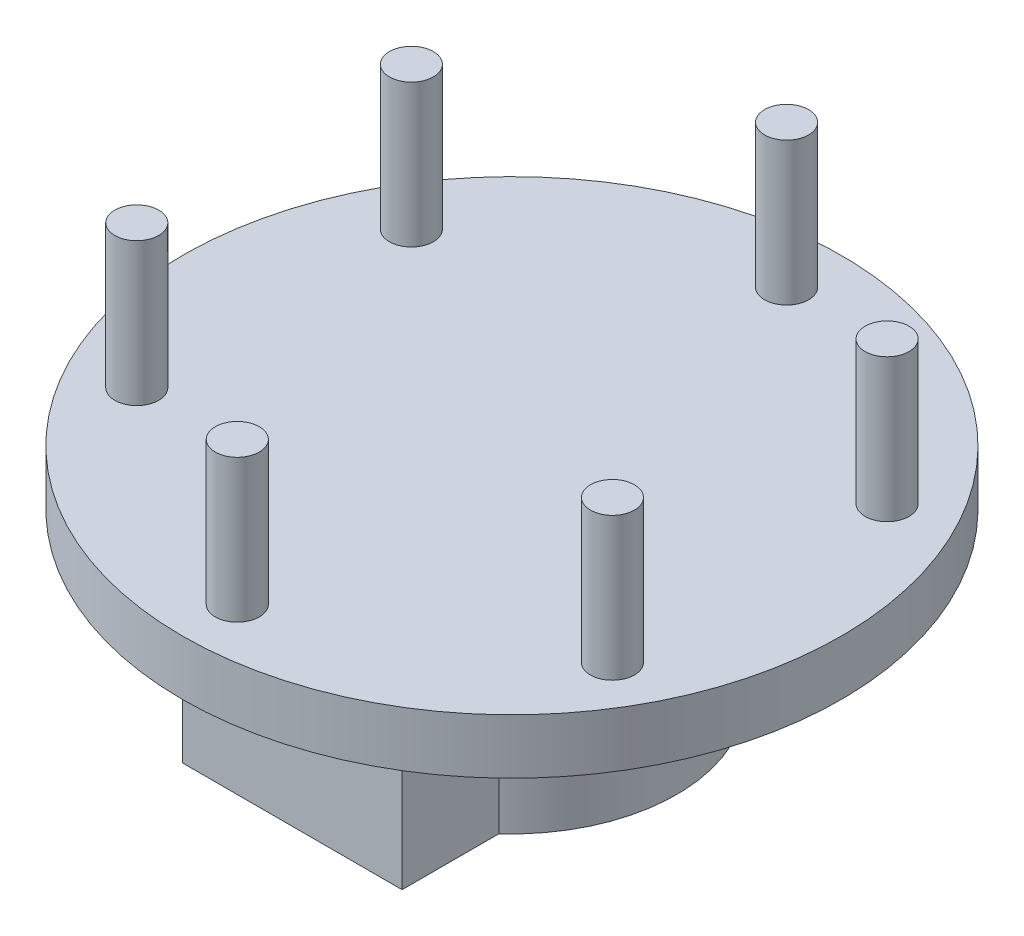
ISO-10303-21;
HEADER;
FILE_DESCRIPTION(('STEP AP214'),'2;1');
FILE_NAME('part.step','',(''),(''),'','','');
FILE_SCHEMA(('AUTOMOTIVE_DESIGN { 1 0 10303 214 1 1 1 1 }'));
ENDSEC;
DATA;
#1=APPLICATION_CONTEXT('core data for automotive mechanical design processes');
#2=APPLICATION_PROTOCOL_DEFINITION('international standard','automotive_design',2000,#1);
#3=PRODUCT_CONTEXT('',#1,'mechanical');
#4=PRODUCT('Part','Part','',(#3));
#5=PRODUCT_RELATED_PRODUCT_CATEGORY('part','',(#4));
#6=PRODUCT_DEFINITION_FORMATION('','',#4);
#7=PRODUCT_DEFINITION_CONTEXT('part definition',#1,'design');
#8=PRODUCT_DEFINITION('design','',#6,#7);
#9=PRODUCT_DEFINITION_SHAPE('','',#8);
#10=(LENGTH_UNIT() NAMED_UNIT(*) SI_UNIT(.MILLI.,.METRE.));
#11=(NAMED_UNIT(*) PLANE_ANGLE_UNIT() SI_UNIT($,.RADIAN.));
#12=(NAMED_UNIT(*) SI_UNIT($,.STERADIAN.) SOLID_ANGLE_UNIT());
#13=UNCERTAINTY_MEASURE_WITH_UNIT(LENGTH_MEASURE(1.E-05),#10,'distance_accuracy_value','');
#14=(GEOMETRIC_REPRESENTATION_CONTEXT(3) GLOBAL_UNCERTAINTY_ASSIGNED_CONTEXT((#13)) GLOBAL_UNIT_ASSIGNED_CONTEXT((#10,
#11,#12)) REPRESENTATION_CONTEXT('',''));
#15=CARTESIAN_POINT('',(0.,0.,0.));
#16=DIRECTION('',(0.,0.,1.));
#17=DIRECTION('',(1.,0.,0.));
#18=AXIS2_PLACEMENT_3D('',#15,#16,#17);
#19=CARTESIAN_POINT('',(0.,0.,0.));
#20=DIRECTION('',(0.,1.,0.));
#21=DIRECTION('',(0.,0.,1.));
#22=AXIS2_PLACEMENT_3D('',#19,#20,#21);
#23=PLANE('',#22);
#24=CARTESIAN_POINT('',(0.,0.,0.));
#25=DIRECTION('',(0.,1.,0.));
#26=DIRECTION('',(0.,0.,1.));
#27=AXIS2_PLACEMENT_3D('',#24,#25,#26);
#28=CIRCLE('',#27,30.);
#29=CARTESIAN_POINT('',(0.,0.,30.));
#30=VERTEX_POINT('',#29);
#31=EDGE_CURVE('E37',#30,#30,#28,.T.);
#32=ORIENTED_EDGE('',*,*,#31,.F.);
#33=EDGE_LOOP('',(#32));
#34=FACE_BOUND('',#33,.T.);
#35=DIRECTION('',(0.,0.,1.));
#36=VECTOR('',#35,1.);
#37=CARTESIAN_POINT('',(10.,0.,20.));
#38=LINE('',#37,#36);
#39=CARTESIAN_POINT('',(10.,0.,11.180339887499));
#40=VERTEX_POINT('',#39);
#41=CARTESIAN_POINT('',(10.,0.,20.));
#42=VERTEX_POINT('',#41);
#43=EDGE_CURVE('E48',#40,#42,#38,.T.);
#44=ORIENTED_EDGE('',*,*,#43,.F.);
#45=CARTESIAN_POINT('',(0.,0.,0.));
#46=DIRECTION('',(0.,-1.,0.));
#47=DIRECTION('',(0.,0.,-1.));
#48=AXIS2_PLACEMENT_3D('',#45,#46,#47);
#49=CIRCLE('',#48,15.);
#50=CARTESIAN_POINT('',(-9.99999999999999,0.,11.180339887499));
#51=VERTEX_POINT('',#50);
#52=EDGE_CURVE('E52',#51,#40,#49,.T.);
#53=ORIENTED_EDGE('',*,*,#52,.F.);
#54=DIRECTION('',(0.,0.,-1.));
#55=VECTOR('',#54,1.);
#56=CARTESIAN_POINT('',(-9.99999999999999,0.,20.));
#57=LINE('',#56,#55);
#58=CARTESIAN_POINT('',(-9.99999999999999,0.,20.));
#59=VERTEX_POINT('',#58);
#60=EDGE_CURVE('E335',#59,#51,#57,.T.);
#61=ORIENTED_EDGE('',*,*,#60,.F.);
#62=DIRECTION('',(-1.,0.,0.));
#63=VECTOR('',#62,1.);
#64=CARTESIAN_POINT('',(-9.99999999999999,0.,20.));
#65=LINE('',#64,#63);
#66=EDGE_CURVE('E341',#42,#59,#65,.T.);
#67=ORIENTED_EDGE('',*,*,#66,.F.);
#68=EDGE_LOOP('',(#44,#53,#61,#67));
#69=FACE_BOUND('',#68,.T.);
#70=ADVANCED_FACE('F33',(#34,#69),#23,.F.);
#71=CARTESIAN_POINT('',(0.,5.,0.));
#72=DIRECTION('',(0.,-1.,0.));
#73=DIRECTION('',(0.,0.,-1.));
#74=AXIS2_PLACEMENT_3D('',#71,#72,#73);
#75=CYLINDRICAL_SURFACE('',#74,30.);
#76=CARTESIAN_POINT('',(0.,5.,0.));
#77=DIRECTION('',(0.,1.,0.));
#78=DIRECTION('',(0.,0.,1.));
#79=AXIS2_PLACEMENT_3D('',#76,#77,#78);
#80=CIRCLE('',#79,30.);
#81=CARTESIAN_POINT('',(0.,5.,30.));
#82=VERTEX_POINT('',#81);
#83=EDGE_CURVE('E11',#82,#82,#80,.T.);
#84=ORIENTED_EDGE('',*,*,#83,.F.);
#85=EDGE_LOOP('',(#84));
#86=FACE_BOUND('',#85,.T.);
#87=ORIENTED_EDGE('',*,*,#31,.T.);
#88=EDGE_LOOP('',(#87));
#89=FACE_BOUND('',#88,.T.);
#90=ADVANCED_FACE('F35',(#86,#89),#75,.T.);
#91=CARTESIAN_POINT('',(0.,5.,0.));
#92=DIRECTION('',(0.,1.,0.));
#93=DIRECTION('',(0.,0.,1.));
#94=AXIS2_PLACEMENT_3D('',#91,#92,#93);
#95=PLANE('',#94);
#96=CARTESIAN_POINT('',(-21.6506350946104,5.,-12.4999999999991));
#97=DIRECTION('',(0.,1.,0.));
#98=DIRECTION('',(0.,0.,1.));
#99=AXIS2_PLACEMENT_3D('',#96,#97,#98);
#100=CIRCLE('',#99,2.);
#101=CARTESIAN_POINT('',(-21.6506350946104,5.,-14.4999999999991));
#102=VERTEX_POINT('',#101);
#103=EDGE_CURVE('E94',#102,#102,#100,.T.);
#104=ORIENTED_EDGE('',*,*,#103,.F.);
#105=EDGE_LOOP('',(#104));
#106=FACE_BOUND('',#105,.T.);
#107=CARTESIAN_POINT('',(-21.6506350946094,5.,12.5000000000009));
#108=DIRECTION('',(0.,1.,0.));
#109=DIRECTION('',(0.,0.,1.));
#110=AXIS2_PLACEMENT_3D('',#107,#108,#109);
#111=CIRCLE('',#110,2.);
#112=CARTESIAN_POINT('',(-21.6506350946094,5.,10.5000000000009));
#113=VERTEX_POINT('',#112);
#114=EDGE_CURVE('E104',#113,#113,#111,.T.);
#115=ORIENTED_EDGE('',*,*,#114,.F.);
#116=EDGE_LOOP('',(#115));
#117=FACE_BOUND('',#116,.T.);
#118=CARTESIAN_POINT('',(2.1224433562867E-12,5.,25.));
#119=DIRECTION('',(0.,1.,0.));
#120=DIRECTION('',(0.,0.,1.));
#121=AXIS2_PLACEMENT_3D('',#118,#119,#120);
#122=CIRCLE('',#121,2.);
#123=CARTESIAN_POINT('',(2.1224433562867E-12,5.,23.));
#124=VERTEX_POINT('',#123);
#125=EDGE_CURVE('E109',#124,#124,#122,.T.);
#126=ORIENTED_EDGE('',*,*,#125,.F.);
#127=EDGE_LOOP('',(#126));
#128=FACE_BOUND('',#127,.T.);
#129=CARTESIAN_POINT('',(21.6506350946126,5.,12.4999999999991));
#130=DIRECTION('',(0.,1.,0.));
#131=DIRECTION('',(0.,0.,1.));
#132=AXIS2_PLACEMENT_3D('',#129,#130,#131);
#133=CIRCLE('',#132,2.);
#134=CARTESIAN_POINT('',(21.6506350946126,5.,10.4999999999991));
#135=VERTEX_POINT('',#134);
#136=EDGE_CURVE('E115',#135,#135,#133,.T.);
#137=ORIENTED_EDGE('',*,*,#136,.F.);
#138=EDGE_LOOP('',(#137));
#139=FACE_BOUND('',#138,.T.);
#140=CARTESIAN_POINT('',(21.6506350946115,5.,-12.5000000000009));
#141=DIRECTION('',(0.,1.,0.));
#142=DIRECTION('',(0.,0.,1.));
#143=AXIS2_PLACEMENT_3D('',#140,#141,#142);
#144=CIRCLE('',#143,2.);
#145=CARTESIAN_POINT('',(21.6506350946115,5.,-14.5000000000009));
#146=VERTEX_POINT('',#145);
#147=EDGE_CURVE('E121',#146,#146,#144,.T.);
#148=ORIENTED_EDGE('',*,*,#147,.F.);
#149=EDGE_LOOP('',(#148));
#150=FACE_BOUND('',#149,.T.);
#151=CARTESIAN_POINT('',(0.,5.,-25.));
#152=DIRECTION('',(0.,1.,0.));
#153=DIRECTION('',(0.,0.,1.));
#154=AXIS2_PLACEMENT_3D('',#151,#152,#153);
#155=CIRCLE('',#154,2.);
#156=CARTESIAN_POINT('',(0.,5.,-27.));
#157=VERTEX_POINT('',#156);
#158=EDGE_CURVE('E127',#157,#157,#155,.T.);
#159=ORIENTED_EDGE('',*,*,#158,.F.);
#160=EDGE_LOOP('',(#159));
#161=FACE_BOUND('',#160,.T.);
#162=ORIENTED_EDGE('',*,*,#83,.T.);
#163=EDGE_LOOP('',(#162));
#164=FACE_BOUND('',#163,.T.);
#165=ADVANCED_FACE('F138',(#106,#117,#128,#139,#150,#161,#164),#95,.T.);
#166=CARTESIAN_POINT('',(0.,18.,-25.));
#167=DIRECTION('',(0.,-1.,0.));
#168=DIRECTION('',(0.,0.,-1.));
#169=AXIS2_PLACEMENT_3D('',#166,#167,#168);
#170=CYLINDRICAL_SURFACE('',#169,2.);
#171=CARTESIAN_POINT('',(0.,18.,-25.));
#172=DIRECTION('',(0.,1.,0.));
#173=DIRECTION('',(0.,0.,1.));
#174=AXIS2_PLACEMENT_3D('',#171,#172,#173);
#175=CIRCLE('',#174,2.);
#176=CARTESIAN_POINT('',(0.,18.,-27.));
#177=VERTEX_POINT('',#176);
#178=EDGE_CURVE('E130',#177,#177,#175,.T.);
#179=CARTESIAN_POINT('',(0.,18.,-27.));
#180=CARTESIAN_POINT('',(0.,17.8645833333333,-27.));
#181=CARTESIAN_POINT('',(0.,17.7291666666667,-27.));
#182=CARTESIAN_POINT('',(0.,17.4583333333333,-27.));
#183=CARTESIAN_POINT('',(0.,17.3229166666667,-27.));
#184=CARTESIAN_POINT('',(0.,17.0520833333333,-27.));
#185=CARTESIAN_POINT('',(0.,16.9166666666667,-27.));
#186=CARTESIAN_POINT('',(0.,16.6458333333333,-27.));
#187=CARTESIAN_POINT('',(0.,16.5104166666667,-27.));
#188=CARTESIAN_POINT('',(0.,16.2395833333333,-27.));
#189=CARTESIAN_POINT('',(0.,16.1041666666667,-27.));
#190=CARTESIAN_POINT('',(0.,15.8333333333333,-27.));
#191=CARTESIAN_POINT('',(0.,15.6979166666667,-27.));
#192=CARTESIAN_POINT('',(0.,15.4270833333333,-27.));
#193=CARTESIAN_POINT('',(0.,15.2916666666667,-27.));
#194=CARTESIAN_POINT('',(0.,15.0208333333333,-27.));
#195=CARTESIAN_POINT('',(0.,14.8854166666667,-27.));
#196=CARTESIAN_POINT('',(0.,14.6145833333333,-27.));
#197=CARTESIAN_POINT('',(0.,14.4791666666667,-27.));
#198=CARTESIAN_POINT('',(0.,14.2083333333333,-27.));
#199=CARTESIAN_POINT('',(0.,14.0729166666667,-27.));
#200=CARTESIAN_POINT('',(0.,13.8020833333333,-27.));
#201=CARTESIAN_POINT('',(0.,13.6666666666667,-27.));
#202=CARTESIAN_POINT('',(0.,13.3958333333333,-27.));
#203=CARTESIAN_POINT('',(0.,13.2604166666667,-27.));
#204=CARTESIAN_POINT('',(0.,12.9895833333333,-27.));
#205=CARTESIAN_POINT('',(0.,12.8541666666667,-27.));
#206=CARTESIAN_POINT('',(0.,12.5833333333333,-27.));
#207=CARTESIAN_POINT('',(0.,12.4479166666667,-27.));
#208=CARTESIAN_POINT('',(0.,12.1770833333333,-27.));
#209=CARTESIAN_POINT('',(0.,12.0416666666667,-27.));
#210=CARTESIAN_POINT('',(0.,11.7708333333333,-27.));
#211=CARTESIAN_POINT('',(0.,11.6354166666667,-27.));
#212=CARTESIAN_POINT('',(0.,11.3645833333333,-27.));
#213=CARTESIAN_POINT('',(0.,11.2291666666667,-27.));
#214=CARTESIAN_POINT('',(0.,10.9583333333333,-27.));
#215=CARTESIAN_POINT('',(0.,10.8229166666667,-27.));
#216=CARTESIAN_POINT('',(0.,10.5520833333333,-27.));
#217=CARTESIAN_POINT('',(0.,10.4166666666667,-27.));
#218=CARTESIAN_POINT('',(0.,10.1458333333333,-27.));
#219=CARTESIAN_POINT('',(0.,10.0104166666667,-27.));
#220=CARTESIAN_POINT('',(0.,9.73958333333333,-27.));
#221=CARTESIAN_POINT('',(0.,9.60416666666667,-27.));
#222=CARTESIAN_POINT('',(0.,9.33333333333333,-27.));
#223=CARTESIAN_POINT('',(0.,9.19791666666667,-27.));
#224=CARTESIAN_POINT('',(0.,8.92708333333333,-27.));
#225=CARTESIAN_POINT('',(0.,8.79166666666667,-27.));
#226=CARTESIAN_POINT('',(0.,8.52083333333333,-27.));
#227=CARTESIAN_POINT('',(0.,8.38541666666667,-27.));
#228=CARTESIAN_POINT('',(0.,8.11458333333333,-27.));
#229=CARTESIAN_POINT('',(0.,7.97916666666667,-27.));
#230=CARTESIAN_POINT('',(0.,7.70833333333333,-27.));
#231=CARTESIAN_POINT('',(0.,7.57291666666667,-27.));
#232=CARTESIAN_POINT('',(0.,7.30208333333333,-27.));
#233=CARTESIAN_POINT('',(0.,7.16666666666667,-27.));
#234=CARTESIAN_POINT('',(0.,6.89583333333333,-27.));
#235=CARTESIAN_POINT('',(0.,6.76041666666667,-27.));
#236=CARTESIAN_POINT('',(0.,6.48958333333333,-27.));
#237=CARTESIAN_POINT('',(0.,6.35416666666667,-27.));
#238=CARTESIAN_POINT('',(0.,6.08333333333333,-27.));
#239=CARTESIAN_POINT('',(0.,5.94791666666667,-27.));
#240=CARTESIAN_POINT('',(0.,5.67708333333333,-27.));
#241=CARTESIAN_POINT('',(0.,5.54166666666667,-27.));
#242=CARTESIAN_POINT('',(0.,5.27083333333333,-27.));
#243=CARTESIAN_POINT('',(0.,5.13541666666667,-27.));
#244=CARTESIAN_POINT('',(0.,5.,-27.));
#245=B_SPLINE_CURVE_WITH_KNOTS('',3,(#179,#180,#181,#182,#183,#184,#185,#186,#187,#188,#189,
#190,#191,#192,#193,#194,#195,#196,#197,#198,#199,#200,#201,#202,#203,#204,#205,#206,#207,#208,
#209,#210,#211,#212,#213,#214,#215,#216,#217,#218,#219,#220,#221,#222,#223,#224,#225,#226,#227,
#228,#229,#230,#231,#232,#233,#234,#235,#236,#237,#238,#239,#240,#241,#242,#243,#244),
.UNSPECIFIED.,.F.,.F.,(4,2,2,2,2,2,2,2,2,2,2,2,2,2,2,2,2,2,2,2,2,2,2,2,2,2,2,2,2,2,2,2,4),(0.,
0.406249999999997,0.812499999999997,1.21875,1.625,2.03125,2.4375,2.84375,3.25,3.65625,4.0625,
4.46875,4.875,5.28125,5.6875,6.09375,6.5,6.90625,7.3125,7.71875,8.125,8.53124999999999,8.9375,
9.34375,9.75,10.15625,10.5625,10.96875,11.375,11.78125,12.1875,12.59375,13.),.UNSPECIFIED.);
#246=EDGE_CURVE('BSEAM136',#177,#157,#245,.T.);
#247=ORIENTED_EDGE('',*,*,#178,.F.);
#248=ORIENTED_EDGE('',*,*,#158,.T.);
#249=ORIENTED_EDGE('',*,*,#246,.T.);
#250=ORIENTED_EDGE('',*,*,#246,.F.);
#251=EDGE_LOOP('',(#247,#249,#248,#250));
#252=FACE_BOUND('',#251,.T.);
#253=ADVANCED_FACE('F136',(#252),#170,.T.);
#254=CARTESIAN_POINT('',(0.,18.,-25.));
#255=DIRECTION('',(0.,1.,0.));
#256=DIRECTION('',(0.,0.,1.));
#257=AXIS2_PLACEMENT_3D('',#254,#255,#256);
#258=PLANE('',#257);
#259=ORIENTED_EDGE('',*,*,#178,.T.);
#260=EDGE_LOOP('',(#259));
#261=FACE_BOUND('',#260,.T.);
#262=ADVANCED_FACE('F156',(#261),#258,.T.);
#263=CARTESIAN_POINT('',(21.6506350946115,18.,-12.5000000000009));
#264=DIRECTION('',(0.,-1.,0.));
#265=DIRECTION('',(0.,0.,-1.));
#266=AXIS2_PLACEMENT_3D('',#263,#264,#265);
#267=CYLINDRICAL_SURFACE('',#266,2.);
#268=CARTESIAN_POINT('',(21.6506350946115,18.,-12.5000000000009));
#269=DIRECTION('',(0.,1.,0.));
#270=DIRECTION('',(0.,0.,1.));
#271=AXIS2_PLACEMENT_3D('',#268,#269,#270);
#272=CIRCLE('',#271,2.);
#273=CARTESIAN_POINT('',(21.6506350946115,18.,-14.5000000000009));
#274=VERTEX_POINT('',#273);
#275=EDGE_CURVE('E124',#274,#274,#272,.T.);
#276=CARTESIAN_POINT('',(21.6506350946115,18.,-14.5000000000009));
#277=CARTESIAN_POINT('',(21.6506350946115,17.8645833333333,-14.5000000000009));
#278=CARTESIAN_POINT('',(21.6506350946115,17.7291666666667,-14.5000000000009));
#279=CARTESIAN_POINT('',(21.6506350946115,17.4583333333333,-14.5000000000009));
#280=CARTESIAN_POINT('',(21.6506350946115,17.3229166666667,-14.5000000000009));
#281=CARTESIAN_POINT('',(21.6506350946115,17.0520833333333,-14.5000000000009));
#282=CARTESIAN_POINT('',(21.6506350946115,16.9166666666667,-14.5000000000009));
#283=CARTESIAN_POINT('',(21.6506350946115,16.6458333333333,-14.5000000000009));
#284=CARTESIAN_POINT('',(21.6506350946115,16.5104166666667,-14.5000000000009));
#285=CARTESIAN_POINT('',(21.6506350946115,16.2395833333333,-14.5000000000009));
#286=CARTESIAN_POINT('',(21.6506350946115,16.1041666666667,-14.5000000000009));
#287=CARTESIAN_POINT('',(21.6506350946115,15.8333333333333,-14.5000000000009));
#288=CARTESIAN_POINT('',(21.6506350946115,15.6979166666667,-14.5000000000009));
#289=CARTESIAN_POINT('',(21.6506350946115,15.4270833333333,-14.5000000000009));
#290=CARTESIAN_POINT('',(21.6506350946115,15.2916666666667,-14.5000000000009));
#291=CARTESIAN_POINT('',(21.6506350946115,15.0208333333333,-14.5000000000009));
#292=CARTESIAN_POINT('',(21.6506350946115,14.8854166666667,-14.5000000000009));
#293=CARTESIAN_POINT('',(21.6506350946115,14.6145833333333,-14.5000000000009));
#294=CARTESIAN_POINT('',(21.6506350946115,14.4791666666667,-14.5000000000009));
#295=CARTESIAN_POINT('',(21.6506350946115,14.2083333333333,-14.5000000000009));
#296=CARTESIAN_POINT('',(21.6506350946115,14.0729166666667,-14.5000000000009));
#297=CARTESIAN_POINT('',(21.6506350946115,13.8020833333333,-14.5000000000009));
#298=CARTESIAN_POINT('',(21.6506350946115,13.6666666666667,-14.5000000000009));
#299=CARTESIAN_POINT('',(21.6506350946115,13.3958333333333,-14.5000000000009));
#300=CARTESIAN_POINT('',(21.6506350946115,13.2604166666667,-14.5000000000009));
#301=CARTESIAN_POINT('',(21.6506350946115,12.9895833333333,-14.5000000000009));
#302=CARTESIAN_POINT('',(21.6506350946115,12.8541666666667,-14.5000000000009));
#303=CARTESIAN_POINT('',(21.6506350946115,12.5833333333333,-14.5000000000009));
#304=CARTESIAN_POINT('',(21.6506350946115,12.4479166666667,-14.5000000000009));
#305=CARTESIAN_POINT('',(21.6506350946115,12.1770833333333,-14.5000000000009));
#306=CARTESIAN_POINT('',(21.6506350946115,12.0416666666667,-14.5000000000009));
#307=CARTESIAN_POINT('',(21.6506350946115,11.7708333333333,-14.5000000000009));
#308=CARTESIAN_POINT('',(21.6506350946115,11.6354166666667,-14.5000000000009));
#309=CARTESIAN_POINT('',(21.6506350946115,11.3645833333333,-14.5000000000009));
#310=CARTESIAN_POINT('',(21.6506350946115,11.2291666666667,-14.5000000000009));
#311=CARTESIAN_POINT('',(21.6506350946115,10.9583333333333,-14.5000000000009));
#312=CARTESIAN_POINT('',(21.6506350946115,10.8229166666667,-14.5000000000009));
#313=CARTESIAN_POINT('',(21.6506350946115,10.5520833333333,-14.5000000000009));
#314=CARTESIAN_POINT('',(21.6506350946115,10.4166666666667,-14.5000000000009));
#315=CARTESIAN_POINT('',(21.6506350946115,10.1458333333333,-14.5000000000009));
#316=CARTESIAN_POINT('',(21.6506350946115,10.0104166666667,-14.5000000000009));
#317=CARTESIAN_POINT('',(21.6506350946115,9.73958333333333,-14.5000000000009));
#318=CARTESIAN_POINT('',(21.6506350946115,9.60416666666667,-14.5000000000009));
#319=CARTESIAN_POINT('',(21.6506350946115,9.33333333333333,-14.5000000000009));
#320=CARTESIAN_POINT('',(21.6506350946115,9.19791666666667,-14.5000000000009));
#321=CARTESIAN_POINT('',(21.6506350946115,8.92708333333333,-14.5000000000009));
#322=CARTESIAN_POINT('',(21.6506350946115,8.79166666666667,-14.5000000000009));
#323=CARTESIAN_POINT('',(21.6506350946115,8.52083333333333,-14.5000000000009));
#324=CARTESIAN_POINT('',(21.6506350946115,8.38541666666667,-14.5000000000009));
#325=CARTESIAN_POINT('',(21.6506350946115,8.11458333333333,-14.5000000000009));
#326=CARTESIAN_POINT('',(21.6506350946115,7.97916666666667,-14.5000000000009));
#327=CARTESIAN_POINT('',(21.6506350946115,7.70833333333333,-14.5000000000009));
#328=CARTESIAN_POINT('',(21.6506350946115,7.57291666666667,-14.5000000000009));
#329=CARTESIAN_POINT('',(21.6506350946115,7.30208333333333,-14.5000000000009));
#330=CARTESIAN_POINT('',(21.6506350946115,7.16666666666667,-14.5000000000009));
#331=CARTESIAN_POINT('',(21.6506350946115,6.89583333333333,-14.5000000000009));
#332=CARTESIAN_POINT('',(21.6506350946115,6.76041666666667,-14.5000000000009));
#333=CARTESIAN_POINT('',(21.6506350946115,6.48958333333333,-14.5000000000009));
#334=CARTESIAN_POINT('',(21.6506350946115,6.35416666666667,-14.5000000000009));
#335=CARTESIAN_POINT('',(21.6506350946115,6.08333333333333,-14.5000000000009));
#336=CARTESIAN_POINT('',(21.6506350946115,5.94791666666667,-14.5000000000009));
#337=CARTESIAN_POINT('',(21.6506350946115,5.67708333333333,-14.5000000000009));
#338=CARTESIAN_POINT('',(21.6506350946115,5.54166666666667,-14.5000000000009));
#339=CARTESIAN_POINT('',(21.6506350946115,5.27083333333333,-14.5000000000009));
#340=CARTESIAN_POINT('',(21.6506350946115,5.13541666666667,-14.5000000000009));
#341=CARTESIAN_POINT('',(21.6506350946115,5.,-14.5000000000009));
#342=B_SPLINE_CURVE_WITH_KNOTS('',3,(#276,#277,#278,#279,#280,#281,#282,#283,#284,#285,#286,
#287,#288,#289,#290,#291,#292,#293,#294,#295,#296,#297,#298,#299,#300,#301,#302,#303,#304,#305,
#306,#307,#308,#309,#310,#311,#312,#313,#314,#315,#316,#317,#318,#319,#320,#321,#322,#323,#324,
#325,#326,#327,#328,#329,#330,#331,#332,#333,#334,#335,#336,#337,#338,#339,#340,#341),
.UNSPECIFIED.,.F.,.F.,(4,2,2,2,2,2,2,2,2,2,2,2,2,2,2,2,2,2,2,2,2,2,2,2,2,2,2,2,2,2,2,2,4),(0.,
0.406249999999997,0.812499999999997,1.21875,1.625,2.03125,2.4375,2.84375,3.25,3.65625,4.0625,
4.46875,4.875,5.28125,5.6875,6.09375,6.5,6.90625,7.3125,7.71875,8.125,8.53124999999999,8.9375,
9.34375,9.75,10.15625,10.5625,10.96875,11.375,11.78125,12.1875,12.59375,13.),.UNSPECIFIED.);
#343=EDGE_CURVE('BSEAM160',#274,#146,#342,.T.);
#344=ORIENTED_EDGE('',*,*,#275,.F.);
#345=ORIENTED_EDGE('',*,*,#147,.T.);
#346=ORIENTED_EDGE('',*,*,#343,.T.);
#347=ORIENTED_EDGE('',*,*,#343,.F.);
#348=EDGE_LOOP('',(#344,#346,#345,#347));
#349=FACE_BOUND('',#348,.T.);
#350=ADVANCED_FACE('F160',(#349),#267,.T.);
#351=CARTESIAN_POINT('',(21.6506350946115,18.,-12.5000000000009));
#352=DIRECTION('',(0.,1.,0.));
#353=DIRECTION('',(0.,0.,1.));
#354=AXIS2_PLACEMENT_3D('',#351,#352,#353);
#355=PLANE('',#354);
#356=ORIENTED_EDGE('',*,*,#275,.T.);
#357=EDGE_LOOP('',(#356));
#358=FACE_BOUND('',#357,.T.);
#359=ADVANCED_FACE('F164',(#358),#355,.T.);
#360=CARTESIAN_POINT('',(21.6506350946126,18.,12.4999999999991));
#361=DIRECTION('',(0.,-1.,0.));
#362=DIRECTION('',(0.,0.,-1.));
#363=AXIS2_PLACEMENT_3D('',#360,#361,#362);
#364=CYLINDRICAL_SURFACE('',#363,2.);
#365=CARTESIAN_POINT('',(21.6506350946126,18.,12.4999999999991));
#366=DIRECTION('',(0.,1.,0.));
#367=DIRECTION('',(0.,0.,1.));
#368=AXIS2_PLACEMENT_3D('',#365,#366,#367);
#369=CIRCLE('',#368,2.);
#370=CARTESIAN_POINT('',(21.6506350946126,18.,10.4999999999991));
#371=VERTEX_POINT('',#370);
#372=EDGE_CURVE('E118',#371,#371,#369,.T.);
#373=CARTESIAN_POINT('',(21.6506350946126,18.,10.4999999999991));
#374=CARTESIAN_POINT('',(21.6506350946126,17.8645833333333,10.4999999999991));
#375=CARTESIAN_POINT('',(21.6506350946126,17.7291666666667,10.4999999999991));
#376=CARTESIAN_POINT('',(21.6506350946126,17.4583333333333,10.4999999999991));
#377=CARTESIAN_POINT('',(21.6506350946126,17.3229166666667,10.4999999999991));
#378=CARTESIAN_POINT('',(21.6506350946126,17.0520833333333,10.4999999999991));
#379=CARTESIAN_POINT('',(21.6506350946126,16.9166666666667,10.4999999999991));
#380=CARTESIAN_POINT('',(21.6506350946126,16.6458333333333,10.4999999999991));
#381=CARTESIAN_POINT('',(21.6506350946126,16.5104166666667,10.4999999999991));
#382=CARTESIAN_POINT('',(21.6506350946126,16.2395833333333,10.4999999999991));
#383=CARTESIAN_POINT('',(21.6506350946126,16.1041666666667,10.4999999999991));
#384=CARTESIAN_POINT('',(21.6506350946126,15.8333333333333,10.4999999999991));
#385=CARTESIAN_POINT('',(21.6506350946126,15.6979166666667,10.4999999999991));
#386=CARTESIAN_POINT('',(21.6506350946126,15.4270833333333,10.4999999999991));
#387=CARTESIAN_POINT('',(21.6506350946126,15.2916666666667,10.4999999999991));
#388=CARTESIAN_POINT('',(21.6506350946126,15.0208333333333,10.4999999999991));
#389=CARTESIAN_POINT('',(21.6506350946126,14.8854166666667,10.4999999999991));
#390=CARTESIAN_POINT('',(21.6506350946126,14.6145833333333,10.4999999999991));
#391=CARTESIAN_POINT('',(21.6506350946126,14.4791666666667,10.4999999999991));
#392=CARTESIAN_POINT('',(21.6506350946126,14.2083333333333,10.4999999999991));
#393=CARTESIAN_POINT('',(21.6506350946126,14.0729166666667,10.4999999999991));
#394=CARTESIAN_POINT('',(21.6506350946126,13.8020833333333,10.4999999999991));
#395=CARTESIAN_POINT('',(21.6506350946126,13.6666666666667,10.4999999999991));
#396=CARTESIAN_POINT('',(21.6506350946126,13.3958333333333,10.4999999999991));
#397=CARTESIAN_POINT('',(21.6506350946126,13.2604166666667,10.4999999999991));
#398=CARTESIAN_POINT('',(21.6506350946126,12.9895833333333,10.4999999999991));
#399=CARTESIAN_POINT('',(21.6506350946126,12.8541666666667,10.4999999999991));
#400=CARTESIAN_POINT('',(21.6506350946126,12.5833333333333,10.4999999999991));
#401=CARTESIAN_POINT('',(21.6506350946126,12.4479166666667,10.4999999999991));
#402=CARTESIAN_POINT('',(21.6506350946126,12.1770833333333,10.4999999999991));
#403=CARTESIAN_POINT('',(21.6506350946126,12.0416666666667,10.4999999999991));
#404=CARTESIAN_POINT('',(21.6506350946126,11.7708333333333,10.4999999999991));
#405=CARTESIAN_POINT('',(21.6506350946126,11.6354166666667,10.4999999999991));
#406=CARTESIAN_POINT('',(21.6506350946126,11.3645833333333,10.4999999999991));
#407=CARTESIAN_POINT('',(21.6506350946126,11.2291666666667,10.4999999999991));
#408=CARTESIAN_POINT('',(21.6506350946126,10.9583333333333,10.4999999999991));
#409=CARTESIAN_POINT('',(21.6506350946126,10.8229166666667,10.4999999999991));
#410=CARTESIAN_POINT('',(21.6506350946126,10.5520833333333,10.4999999999991));
#411=CARTESIAN_POINT('',(21.6506350946126,10.4166666666667,10.4999999999991));
#412=CARTESIAN_POINT('',(21.6506350946126,10.1458333333333,10.4999999999991));
#413=CARTESIAN_POINT('',(21.6506350946126,10.0104166666667,10.4999999999991));
#414=CARTESIAN_POINT('',(21.6506350946126,9.73958333333333,10.4999999999991));
#415=CARTESIAN_POINT('',(21.6506350946126,9.60416666666667,10.4999999999991));
#416=CARTESIAN_POINT('',(21.6506350946126,9.33333333333333,10.4999999999991));
#417=CARTESIAN_POINT('',(21.6506350946126,9.19791666666667,10.4999999999991));
#418=CARTESIAN_POINT('',(21.6506350946126,8.92708333333333,10.4999999999991));
#419=CARTESIAN_POINT('',(21.6506350946126,8.79166666666667,10.4999999999991));
#420=CARTESIAN_POINT('',(21.6506350946126,8.52083333333333,10.4999999999991));
#421=CARTESIAN_POINT('',(21.6506350946126,8.38541666666667,10.4999999999991));
#422=CARTESIAN_POINT('',(21.6506350946126,8.11458333333333,10.4999999999991));
#423=CARTESIAN_POINT('',(21.6506350946126,7.97916666666667,10.4999999999991));
#424=CARTESIAN_POINT('',(21.6506350946126,7.70833333333333,10.4999999999991));
#425=CARTESIAN_POINT('',(21.6506350946126,7.57291666666667,10.4999999999991));
#426=CARTESIAN_POINT('',(21.6506350946126,7.30208333333333,10.4999999999991));
#427=CARTESIAN_POINT('',(21.6506350946126,7.16666666666667,10.4999999999991));
#428=CARTESIAN_POINT('',(21.6506350946126,6.89583333333333,10.4999999999991));
#429=CARTESIAN_POINT('',(21.6506350946126,6.76041666666667,10.4999999999991));
#430=CARTESIAN_POINT('',(21.6506350946126,6.48958333333333,10.4999999999991));
#431=CARTESIAN_POINT('',(21.6506350946126,6.35416666666667,10.4999999999991));
#432=CARTESIAN_POINT('',(21.6506350946126,6.08333333333333,10.4999999999991));
#433=CARTESIAN_POINT('',(21.6506350946126,5.94791666666667,10.4999999999991));
#434=CARTESIAN_POINT('',(21.6506350946126,5.67708333333333,10.4999999999991));
#435=CARTESIAN_POINT('',(21.6506350946126,5.54166666666667,10.4999999999991));
#436=CARTESIAN_POINT('',(21.6506350946126,5.27083333333333,10.4999999999991));
#437=CARTESIAN_POINT('',(21.6506350946126,5.13541666666667,10.4999999999991));
#438=CARTESIAN_POINT('',(21.6506350946126,5.,10.4999999999991));
#439=B_SPLINE_CURVE_WITH_KNOTS('',3,(#373,#374,#375,#376,#377,#378,#379,#380,#381,#382,#383,
#384,#385,#386,#387,#388,#389,#390,#391,#392,#393,#394,#395,#396,#397,#398,#399,#400,#401,#402,
#403,#404,#405,#406,#407,#408,#409,#410,#411,#412,#413,#414,#415,#416,#417,#418,#419,#420,#421,
#422,#423,#424,#425,#426,#427,#428,#429,#430,#431,#432,#433,#434,#435,#436,#437,#438),
.UNSPECIFIED.,.F.,.F.,(4,2,2,2,2,2,2,2,2,2,2,2,2,2,2,2,2,2,2,2,2,2,2,2,2,2,2,2,2,2,2,2,4),(0.,
0.406249999999997,0.812499999999997,1.21875,1.625,2.03125,2.4375,2.84375,3.25,3.65625,4.0625,
4.46875,4.875,5.28125,5.6875,6.09375,6.5,6.90625,7.3125,7.71875,8.125,8.53124999999999,8.9375,
9.34375,9.75,10.15625,10.5625,10.96875,11.375,11.78125,12.1875,12.59375,13.),.UNSPECIFIED.);
#440=EDGE_CURVE('BSEAM168',#371,#135,#439,.T.);
#441=ORIENTED_EDGE('',*,*,#372,.F.);
#442=ORIENTED_EDGE('',*,*,#136,.T.);
#443=ORIENTED_EDGE('',*,*,#440,.T.);
#444=ORIENTED_EDGE('',*,*,#440,.F.);
#445=EDGE_LOOP('',(#441,#443,#442,#444));
#446=FACE_BOUND('',#445,.T.);
#447=ADVANCED_FACE('F168',(#446),#364,.T.);
#448=CARTESIAN_POINT('',(21.6506350946126,18.,12.4999999999991));
#449=DIRECTION('',(0.,1.,0.));
#450=DIRECTION('',(0.,0.,1.));
#451=AXIS2_PLACEMENT_3D('',#448,#449,#450);
#452=PLANE('',#451);
#453=ORIENTED_EDGE('',*,*,#372,.T.);
#454=EDGE_LOOP('',(#453));
#455=FACE_BOUND('',#454,.T.);
#456=ADVANCED_FACE('F172',(#455),#452,.T.);
#457=CARTESIAN_POINT('',(2.1224433562867E-12,18.,25.));
#458=DIRECTION('',(0.,-1.,0.));
#459=DIRECTION('',(0.,0.,-1.));
#460=AXIS2_PLACEMENT_3D('',#457,#458,#459);
#461=CYLINDRICAL_SURFACE('',#460,2.);
#462=CARTESIAN_POINT('',(2.1224433562867E-12,18.,25.));
#463=DIRECTION('',(0.,1.,0.));
#464=DIRECTION('',(0.,0.,1.));
#465=AXIS2_PLACEMENT_3D('',#462,#463,#464);
#466=CIRCLE('',#465,2.);
#467=CARTESIAN_POINT('',(2.1224433562867E-12,18.,23.));
#468=VERTEX_POINT('',#467);
#469=EDGE_CURVE('E112',#468,#468,#466,.T.);
#470=CARTESIAN_POINT('',(2.1224433562867E-12,18.,23.));
#471=CARTESIAN_POINT('',(2.1224433562867E-12,17.8645833333333,23.));
#472=CARTESIAN_POINT('',(2.1224433562867E-12,17.7291666666667,23.));
#473=CARTESIAN_POINT('',(2.1224433562867E-12,17.4583333333333,23.));
#474=CARTESIAN_POINT('',(2.1224433562867E-12,17.3229166666667,23.));
#475=CARTESIAN_POINT('',(2.1224433562867E-12,17.0520833333333,23.));
#476=CARTESIAN_POINT('',(2.1224433562867E-12,16.9166666666667,23.));
#477=CARTESIAN_POINT('',(2.1224433562867E-12,16.6458333333333,23.));
#478=CARTESIAN_POINT('',(2.1224433562867E-12,16.5104166666667,23.));
#479=CARTESIAN_POINT('',(2.1224433562867E-12,16.2395833333333,23.));
#480=CARTESIAN_POINT('',(2.1224433562867E-12,16.1041666666667,23.));
#481=CARTESIAN_POINT('',(2.1224433562867E-12,15.8333333333333,23.));
#482=CARTESIAN_POINT('',(2.1224433562867E-12,15.6979166666667,23.));
#483=CARTESIAN_POINT('',(2.1224433562867E-12,15.4270833333333,23.));
#484=CARTESIAN_POINT('',(2.1224433562867E-12,15.2916666666667,23.));
#485=CARTESIAN_POINT('',(2.1224433562867E-12,15.0208333333333,23.));
#486=CARTESIAN_POINT('',(2.1224433562867E-12,14.8854166666667,23.));
#487=CARTESIAN_POINT('',(2.1224433562867E-12,14.6145833333333,23.));
#488=CARTESIAN_POINT('',(2.1224433562867E-12,14.4791666666667,23.));
#489=CARTESIAN_POINT('',(2.1224433562867E-12,14.2083333333333,23.));
#490=CARTESIAN_POINT('',(2.1224433562867E-12,14.0729166666667,23.));
#491=CARTESIAN_POINT('',(2.1224433562867E-12,13.8020833333333,23.));
#492=CARTESIAN_POINT('',(2.1224433562867E-12,13.6666666666667,23.));
#493=CARTESIAN_POINT('',(2.1224433562867E-12,13.3958333333333,23.));
#494=CARTESIAN_POINT('',(2.1224433562867E-12,13.2604166666667,23.));
#495=CARTESIAN_POINT('',(2.1224433562867E-12,12.9895833333333,23.));
#496=CARTESIAN_POINT('',(2.1224433562867E-12,12.8541666666667,23.));
#497=CARTESIAN_POINT('',(2.1224433562867E-12,12.5833333333333,23.));
#498=CARTESIAN_POINT('',(2.1224433562867E-12,12.4479166666667,23.));
#499=CARTESIAN_POINT('',(2.1224433562867E-12,12.1770833333333,23.));
#500=CARTESIAN_POINT('',(2.1224433562867E-12,12.0416666666667,23.));
#501=CARTESIAN_POINT('',(2.1224433562867E-12,11.7708333333333,23.));
#502=CARTESIAN_POINT('',(2.1224433562867E-12,11.6354166666667,23.));
#503=CARTESIAN_POINT('',(2.1224433562867E-12,11.3645833333333,23.));
#504=CARTESIAN_POINT('',(2.1224433562867E-12,11.2291666666667,23.));
#505=CARTESIAN_POINT('',(2.1224433562867E-12,10.9583333333333,23.));
#506=CARTESIAN_POINT('',(2.1224433562867E-12,10.8229166666667,23.));
#507=CARTESIAN_POINT('',(2.1224433562867E-12,10.5520833333333,23.));
#508=CARTESIAN_POINT('',(2.1224433562867E-12,10.4166666666667,23.));
#509=CARTESIAN_POINT('',(2.1224433562867E-12,10.1458333333333,23.));
#510=CARTESIAN_POINT('',(2.1224433562867E-12,10.0104166666667,23.));
#511=CARTESIAN_POINT('',(2.1224433562867E-12,9.73958333333333,23.));
#512=CARTESIAN_POINT('',(2.1224433562867E-12,9.60416666666667,23.));
#513=CARTESIAN_POINT('',(2.1224433562867E-12,9.33333333333333,23.));
#514=CARTESIAN_POINT('',(2.1224433562867E-12,9.19791666666667,23.));
#515=CARTESIAN_POINT('',(2.1224433562867E-12,8.92708333333333,23.));
#516=CARTESIAN_POINT('',(2.1224433562867E-12,8.79166666666667,23.));
#517=CARTESIAN_POINT('',(2.1224433562867E-12,8.52083333333333,23.));
#518=CARTESIAN_POINT('',(2.1224433562867E-12,8.38541666666667,23.));
#519=CARTESIAN_POINT('',(2.1224433562867E-12,8.11458333333333,23.));
#520=CARTESIAN_POINT('',(2.1224433562867E-12,7.97916666666667,23.));
#521=CARTESIAN_POINT('',(2.1224433562867E-12,7.70833333333333,23.));
#522=CARTESIAN_POINT('',(2.1224433562867E-12,7.57291666666667,23.));
#523=CARTESIAN_POINT('',(2.1224433562867E-12,7.30208333333333,23.));
#524=CARTESIAN_POINT('',(2.1224433562867E-12,7.16666666666667,23.));
#525=CARTESIAN_POINT('',(2.1224433562867E-12,6.89583333333333,23.));
#526=CARTESIAN_POINT('',(2.1224433562867E-12,6.76041666666667,23.));
#527=CARTESIAN_POINT('',(2.1224433562867E-12,6.48958333333333,23.));
#528=CARTESIAN_POINT('',(2.1224433562867E-12,6.35416666666667,23.));
#529=CARTESIAN_POINT('',(2.1224433562867E-12,6.08333333333333,23.));
#530=CARTESIAN_POINT('',(2.1224433562867E-12,5.94791666666667,23.));
#531=CARTESIAN_POINT('',(2.1224433562867E-12,5.67708333333333,23.));
#532=CARTESIAN_POINT('',(2.1224433562867E-12,5.54166666666667,23.));
#533=CARTESIAN_POINT('',(2.1224433562867E-12,5.27083333333333,23.));
#534=CARTESIAN_POINT('',(2.1224433562867E-12,5.13541666666667,23.));
#535=CARTESIAN_POINT('',(2.1224433562867E-12,5.,23.));
#536=B_SPLINE_CURVE_WITH_KNOTS('',3,(#470,#471,#472,#473,#474,#475,#476,#477,#478,#479,#480,
#481,#482,#483,#484,#485,#486,#487,#488,#489,#490,#491,#492,#493,#494,#495,#496,#497,#498,#499,
#500,#501,#502,#503,#504,#505,#506,#507,#508,#509,#510,#511,#512,#513,#514,#515,#516,#517,#518,
#519,#520,#521,#522,#523,#524,#525,#526,#527,#528,#529,#530,#531,#532,#533,#534,#535),
.UNSPECIFIED.,.F.,.F.,(4,2,2,2,2,2,2,2,2,2,2,2,2,2,2,2,2,2,2,2,2,2,2,2,2,2,2,2,2,2,2,2,4),(0.,
0.406249999999997,0.812499999999997,1.21875,1.625,2.03125,2.4375,2.84375,3.25,3.65625,4.0625,
4.46875,4.875,5.28125,5.6875,6.09375,6.5,6.90625,7.3125,7.71875,8.125,8.53124999999999,8.9375,
9.34375,9.75,10.15625,10.5625,10.96875,11.375,11.78125,12.1875,12.59375,13.),.UNSPECIFIED.);
#537=EDGE_CURVE('BSEAM176',#468,#124,#536,.T.);
#538=ORIENTED_EDGE('',*,*,#469,.F.);
#539=ORIENTED_EDGE('',*,*,#125,.T.);
#540=ORIENTED_EDGE('',*,*,#537,.T.);
#541=ORIENTED_EDGE('',*,*,#537,.F.);
#542=EDGE_LOOP('',(#538,#540,#539,#541));
#543=FACE_BOUND('',#542,.T.);
#544=ADVANCED_FACE('F176',(#543),#461,.T.);
#545=CARTESIAN_POINT('',(2.1224433562867E-12,18.,25.));
#546=DIRECTION('',(0.,1.,0.));
#547=DIRECTION('',(0.,0.,1.));
#548=AXIS2_PLACEMENT_3D('',#545,#546,#547);
#549=PLANE('',#548);
#550=ORIENTED_EDGE('',*,*,#469,.T.);
#551=EDGE_LOOP('',(#550));
#552=FACE_BOUND('',#551,.T.);
#553=ADVANCED_FACE('F180',(#552),#549,.T.);
#554=CARTESIAN_POINT('',(-21.6506350946094,18.,12.5000000000009));
#555=DIRECTION('',(0.,-1.,0.));
#556=DIRECTION('',(0.,0.,-1.));
#557=AXIS2_PLACEMENT_3D('',#554,#555,#556);
#558=CYLINDRICAL_SURFACE('',#557,2.);
#559=CARTESIAN_POINT('',(-21.6506350946094,18.,12.5000000000009));
#560=DIRECTION('',(0.,1.,0.));
#561=DIRECTION('',(0.,0.,1.));
#562=AXIS2_PLACEMENT_3D('',#559,#560,#561);
#563=CIRCLE('',#562,2.);
#564=CARTESIAN_POINT('',(-21.6506350946094,18.,10.5000000000009));
#565=VERTEX_POINT('',#564);
#566=EDGE_CURVE('E106',#565,#565,#563,.T.);
#567=CARTESIAN_POINT('',(-21.6506350946094,18.,10.5000000000009));
#568=CARTESIAN_POINT('',(-21.6506350946094,17.8645833333333,10.5000000000009));
#569=CARTESIAN_POINT('',(-21.6506350946094,17.7291666666667,10.5000000000009));
#570=CARTESIAN_POINT('',(-21.6506350946094,17.4583333333333,10.5000000000009));
#571=CARTESIAN_POINT('',(-21.6506350946094,17.3229166666667,10.5000000000009));
#572=CARTESIAN_POINT('',(-21.6506350946094,17.0520833333333,10.5000000000009));
#573=CARTESIAN_POINT('',(-21.6506350946094,16.9166666666667,10.5000000000009));
#574=CARTESIAN_POINT('',(-21.6506350946094,16.6458333333333,10.5000000000009));
#575=CARTESIAN_POINT('',(-21.6506350946094,16.5104166666667,10.5000000000009));
#576=CARTESIAN_POINT('',(-21.6506350946094,16.2395833333333,10.5000000000009));
#577=CARTESIAN_POINT('',(-21.6506350946094,16.1041666666667,10.5000000000009));
#578=CARTESIAN_POINT('',(-21.6506350946094,15.8333333333333,10.5000000000009));
#579=CARTESIAN_POINT('',(-21.6506350946094,15.6979166666667,10.5000000000009));
#580=CARTESIAN_POINT('',(-21.6506350946094,15.4270833333333,10.5000000000009));
#581=CARTESIAN_POINT('',(-21.6506350946094,15.2916666666667,10.5000000000009));
#582=CARTESIAN_POINT('',(-21.6506350946094,15.0208333333333,10.5000000000009));
#583=CARTESIAN_POINT('',(-21.6506350946094,14.8854166666667,10.5000000000009));
#584=CARTESIAN_POINT('',(-21.6506350946094,14.6145833333333,10.5000000000009));
#585=CARTESIAN_POINT('',(-21.6506350946094,14.4791666666667,10.5000000000009));
#586=CARTESIAN_POINT('',(-21.6506350946094,14.2083333333333,10.5000000000009));
#587=CARTESIAN_POINT('',(-21.6506350946094,14.0729166666667,10.5000000000009));
#588=CARTESIAN_POINT('',(-21.6506350946094,13.8020833333333,10.5000000000009));
#589=CARTESIAN_POINT('',(-21.6506350946094,13.6666666666667,10.5000000000009));
#590=CARTESIAN_POINT('',(-21.6506350946094,13.3958333333333,10.5000000000009));
#591=CARTESIAN_POINT('',(-21.6506350946094,13.2604166666667,10.5000000000009));
#592=CARTESIAN_POINT('',(-21.6506350946094,12.9895833333333,10.5000000000009));
#593=CARTESIAN_POINT('',(-21.6506350946094,12.8541666666667,10.5000000000009));
#594=CARTESIAN_POINT('',(-21.6506350946094,12.5833333333333,10.5000000000009));
#595=CARTESIAN_POINT('',(-21.6506350946094,12.4479166666667,10.5000000000009));
#596=CARTESIAN_POINT('',(-21.6506350946094,12.1770833333333,10.5000000000009));
#597=CARTESIAN_POINT('',(-21.6506350946094,12.0416666666667,10.5000000000009));
#598=CARTESIAN_POINT('',(-21.6506350946094,11.7708333333333,10.5000000000009));
#599=CARTESIAN_POINT('',(-21.6506350946094,11.6354166666667,10.5000000000009));
#600=CARTESIAN_POINT('',(-21.6506350946094,11.3645833333333,10.5000000000009));
#601=CARTESIAN_POINT('',(-21.6506350946094,11.2291666666667,10.5000000000009));
#602=CARTESIAN_POINT('',(-21.6506350946094,10.9583333333333,10.5000000000009));
#603=CARTESIAN_POINT('',(-21.6506350946094,10.8229166666667,10.5000000000009));
#604=CARTESIAN_POINT('',(-21.6506350946094,10.5520833333333,10.5000000000009));
#605=CARTESIAN_POINT('',(-21.6506350946094,10.4166666666667,10.5000000000009));
#606=CARTESIAN_POINT('',(-21.6506350946094,10.1458333333333,10.5000000000009));
#607=CARTESIAN_POINT('',(-21.6506350946094,10.0104166666667,10.5000000000009));
#608=CARTESIAN_POINT('',(-21.6506350946094,9.73958333333333,10.5000000000009));
#609=CARTESIAN_POINT('',(-21.6506350946094,9.60416666666667,10.5000000000009));
#610=CARTESIAN_POINT('',(-21.6506350946094,9.33333333333333,10.5000000000009));
#611=CARTESIAN_POINT('',(-21.6506350946094,9.19791666666667,10.5000000000009));
#612=CARTESIAN_POINT('',(-21.6506350946094,8.92708333333333,10.5000000000009));
#613=CARTESIAN_POINT('',(-21.6506350946094,8.79166666666667,10.5000000000009));
#614=CARTESIAN_POINT('',(-21.6506350946094,8.52083333333333,10.5000000000009));
#615=CARTESIAN_POINT('',(-21.6506350946094,8.38541666666667,10.5000000000009));
#616=CARTESIAN_POINT('',(-21.6506350946094,8.11458333333333,10.5000000000009));
#617=CARTESIAN_POINT('',(-21.6506350946094,7.97916666666667,10.5000000000009));
#618=CARTESIAN_POINT('',(-21.6506350946094,7.70833333333333,10.5000000000009));
#619=CARTESIAN_POINT('',(-21.6506350946094,7.57291666666667,10.5000000000009));
#620=CARTESIAN_POINT('',(-21.6506350946094,7.30208333333333,10.5000000000009));
#621=CARTESIAN_POINT('',(-21.6506350946094,7.16666666666667,10.5000000000009));
#622=CARTESIAN_POINT('',(-21.6506350946094,6.89583333333333,10.5000000000009));
#623=CARTESIAN_POINT('',(-21.6506350946094,6.76041666666667,10.5000000000009));
#624=CARTESIAN_POINT('',(-21.6506350946094,6.48958333333333,10.5000000000009));
#625=CARTESIAN_POINT('',(-21.6506350946094,6.35416666666667,10.5000000000009));
#626=CARTESIAN_POINT('',(-21.6506350946094,6.08333333333333,10.5000000000009));
#627=CARTESIAN_POINT('',(-21.6506350946094,5.94791666666667,10.5000000000009));
#628=CARTESIAN_POINT('',(-21.6506350946094,5.67708333333333,10.5000000000009));
#629=CARTESIAN_POINT('',(-21.6506350946094,5.54166666666667,10.5000000000009));
#630=CARTESIAN_POINT('',(-21.6506350946094,5.27083333333333,10.5000000000009));
#631=CARTESIAN_POINT('',(-21.6506350946094,5.13541666666667,10.5000000000009));
#632=CARTESIAN_POINT('',(-21.6506350946094,5.,10.5000000000009));
#633=B_SPLINE_CURVE_WITH_KNOTS('',3,(#567,#568,#569,#570,#571,#572,#573,#574,#575,#576,#577,
#578,#579,#580,#581,#582,#583,#584,#585,#586,#587,#588,#589,#590,#591,#592,#593,#594,#595,#596,
#597,#598,#599,#600,#601,#602,#603,#604,#605,#606,#607,#608,#609,#610,#611,#612,#613,#614,#615,
#616,#617,#618,#619,#620,#621,#622,#623,#624,#625,#626,#627,#628,#629,#630,#631,#632),
.UNSPECIFIED.,.F.,.F.,(4,2,2,2,2,2,2,2,2,2,2,2,2,2,2,2,2,2,2,2,2,2,2,2,2,2,2,2,2,2,2,2,4),(0.,
0.406249999999997,0.812499999999997,1.21875,1.625,2.03125,2.4375,2.84375,3.25,3.65625,4.0625,
4.46875,4.875,5.28125,5.6875,6.09375,6.5,6.90625,7.3125,7.71875,8.125,8.53124999999999,8.9375,
9.34375,9.75,10.15625,10.5625,10.96875,11.375,11.78125,12.1875,12.59375,13.),.UNSPECIFIED.);
#634=EDGE_CURVE('BSEAM184',#565,#113,#633,.T.);
#635=ORIENTED_EDGE('',*,*,#566,.F.);
#636=ORIENTED_EDGE('',*,*,#114,.T.);
#637=ORIENTED_EDGE('',*,*,#634,.T.);
#638=ORIENTED_EDGE('',*,*,#634,.F.);
#639=EDGE_LOOP('',(#635,#637,#636,#638));
#640=FACE_BOUND('',#639,.T.);
#641=ADVANCED_FACE('F184',(#640),#558,.T.);
#642=CARTESIAN_POINT('',(-21.6506350946094,18.,12.5000000000009));
#643=DIRECTION('',(0.,1.,0.));
#644=DIRECTION('',(0.,0.,1.));
#645=AXIS2_PLACEMENT_3D('',#642,#643,#644);
#646=PLANE('',#645);
#647=ORIENTED_EDGE('',*,*,#566,.T.);
#648=EDGE_LOOP('',(#647));
#649=FACE_BOUND('',#648,.T.);
#650=ADVANCED_FACE('F188',(#649),#646,.T.);
#651=CARTESIAN_POINT('',(-21.6506350946104,18.,-12.4999999999991));
#652=DIRECTION('',(0.,-1.,0.));
#653=DIRECTION('',(0.,0.,-1.));
#654=AXIS2_PLACEMENT_3D('',#651,#652,#653);
#655=CYLINDRICAL_SURFACE('',#654,2.);
#656=CARTESIAN_POINT('',(-21.6506350946104,18.,-12.4999999999991));
#657=DIRECTION('',(0.,1.,0.));
#658=DIRECTION('',(0.,0.,1.));
#659=AXIS2_PLACEMENT_3D('',#656,#657,#658);
#660=CIRCLE('',#659,2.);
#661=CARTESIAN_POINT('',(-21.6506350946104,18.,-14.4999999999991));
#662=VERTEX_POINT('',#661);
#663=EDGE_CURVE('E97',#662,#662,#660,.T.);
#664=CARTESIAN_POINT('',(-21.6506350946104,18.,-14.4999999999991));
#665=CARTESIAN_POINT('',(-21.6506350946104,17.8645833333333,-14.4999999999991));
#666=CARTESIAN_POINT('',(-21.6506350946104,17.7291666666667,-14.4999999999991));
#667=CARTESIAN_POINT('',(-21.6506350946104,17.4583333333333,-14.4999999999991));
#668=CARTESIAN_POINT('',(-21.6506350946104,17.3229166666667,-14.4999999999991));
#669=CARTESIAN_POINT('',(-21.6506350946104,17.0520833333333,-14.4999999999991));
#670=CARTESIAN_POINT('',(-21.6506350946104,16.9166666666667,-14.4999999999991));
#671=CARTESIAN_POINT('',(-21.6506350946104,16.6458333333333,-14.4999999999991));
#672=CARTESIAN_POINT('',(-21.6506350946104,16.5104166666667,-14.4999999999991));
#673=CARTESIAN_POINT('',(-21.6506350946104,16.2395833333333,-14.4999999999991));
#674=CARTESIAN_POINT('',(-21.6506350946104,16.1041666666667,-14.4999999999991));
#675=CARTESIAN_POINT('',(-21.6506350946104,15.8333333333333,-14.4999999999991));
#676=CARTESIAN_POINT('',(-21.6506350946104,15.6979166666667,-14.4999999999991));
#677=CARTESIAN_POINT('',(-21.6506350946104,15.4270833333333,-14.4999999999991));
#678=CARTESIAN_POINT('',(-21.6506350946104,15.2916666666667,-14.4999999999991));
#679=CARTESIAN_POINT('',(-21.6506350946104,15.0208333333333,-14.4999999999991));
#680=CARTESIAN_POINT('',(-21.6506350946104,14.8854166666667,-14.4999999999991));
#681=CARTESIAN_POINT('',(-21.6506350946104,14.6145833333333,-14.4999999999991));
#682=CARTESIAN_POINT('',(-21.6506350946104,14.4791666666667,-14.4999999999991));
#683=CARTESIAN_POINT('',(-21.6506350946104,14.2083333333333,-14.4999999999991));
#684=CARTESIAN_POINT('',(-21.6506350946104,14.0729166666667,-14.4999999999991));
#685=CARTESIAN_POINT('',(-21.6506350946104,13.8020833333333,-14.4999999999991));
#686=CARTESIAN_POINT('',(-21.6506350946104,13.6666666666667,-14.4999999999991));
#687=CARTESIAN_POINT('',(-21.6506350946104,13.3958333333333,-14.4999999999991));
#688=CARTESIAN_POINT('',(-21.6506350946104,13.2604166666667,-14.4999999999991));
#689=CARTESIAN_POINT('',(-21.6506350946104,12.9895833333333,-14.4999999999991));
#690=CARTESIAN_POINT('',(-21.6506350946104,12.8541666666667,-14.4999999999991));
#691=CARTESIAN_POINT('',(-21.6506350946104,12.5833333333333,-14.4999999999991));
#692=CARTESIAN_POINT('',(-21.6506350946104,12.4479166666667,-14.4999999999991));
#693=CARTESIAN_POINT('',(-21.6506350946104,12.1770833333333,-14.4999999999991));
#694=CARTESIAN_POINT('',(-21.6506350946104,12.0416666666667,-14.4999999999991));
#695=CARTESIAN_POINT('',(-21.6506350946104,11.7708333333333,-14.4999999999991));
#696=CARTESIAN_POINT('',(-21.6506350946104,11.6354166666667,-14.4999999999991));
#697=CARTESIAN_POINT('',(-21.6506350946104,11.3645833333333,-14.4999999999991));
#698=CARTESIAN_POINT('',(-21.6506350946104,11.2291666666667,-14.4999999999991));
#699=CARTESIAN_POINT('',(-21.6506350946104,10.9583333333333,-14.4999999999991));
#700=CARTESIAN_POINT('',(-21.6506350946104,10.8229166666667,-14.4999999999991));
#701=CARTESIAN_POINT('',(-21.6506350946104,10.5520833333333,-14.4999999999991));
#702=CARTESIAN_POINT('',(-21.6506350946104,10.4166666666667,-14.4999999999991));
#703=CARTESIAN_POINT('',(-21.6506350946104,10.1458333333333,-14.4999999999991));
#704=CARTESIAN_POINT('',(-21.6506350946104,10.0104166666667,-14.4999999999991));
#705=CARTESIAN_POINT('',(-21.6506350946104,9.73958333333333,-14.4999999999991));
#706=CARTESIAN_POINT('',(-21.6506350946104,9.60416666666667,-14.4999999999991));
#707=CARTESIAN_POINT('',(-21.6506350946104,9.33333333333333,-14.4999999999991));
#708=CARTESIAN_POINT('',(-21.6506350946104,9.19791666666667,-14.4999999999991));
#709=CARTESIAN_POINT('',(-21.6506350946104,8.92708333333333,-14.4999999999991));
#710=CARTESIAN_POINT('',(-21.6506350946104,8.79166666666667,-14.4999999999991));
#711=CARTESIAN_POINT('',(-21.6506350946104,8.52083333333333,-14.4999999999991));
#712=CARTESIAN_POINT('',(-21.6506350946104,8.38541666666667,-14.4999999999991));
#713=CARTESIAN_POINT('',(-21.6506350946104,8.11458333333333,-14.4999999999991));
#714=CARTESIAN_POINT('',(-21.6506350946104,7.97916666666667,-14.4999999999991));
#715=CARTESIAN_POINT('',(-21.6506350946104,7.70833333333333,-14.4999999999991));
#716=CARTESIAN_POINT('',(-21.6506350946104,7.57291666666667,-14.4999999999991));
#717=CARTESIAN_POINT('',(-21.6506350946104,7.30208333333333,-14.4999999999991));
#718=CARTESIAN_POINT('',(-21.6506350946104,7.16666666666667,-14.4999999999991));
#719=CARTESIAN_POINT('',(-21.6506350946104,6.89583333333333,-14.4999999999991));
#720=CARTESIAN_POINT('',(-21.6506350946104,6.76041666666667,-14.4999999999991));
#721=CARTESIAN_POINT('',(-21.6506350946104,6.48958333333333,-14.4999999999991));
#722=CARTESIAN_POINT('',(-21.6506350946104,6.35416666666667,-14.4999999999991));
#723=CARTESIAN_POINT('',(-21.6506350946104,6.08333333333333,-14.4999999999991));
#724=CARTESIAN_POINT('',(-21.6506350946104,5.94791666666667,-14.4999999999991));
#725=CARTESIAN_POINT('',(-21.6506350946104,5.67708333333333,-14.4999999999991));
#726=CARTESIAN_POINT('',(-21.6506350946104,5.54166666666667,-14.4999999999991));
#727=CARTESIAN_POINT('',(-21.6506350946104,5.27083333333333,-14.4999999999991));
#728=CARTESIAN_POINT('',(-21.6506350946104,5.13541666666667,-14.4999999999991));
#729=CARTESIAN_POINT('',(-21.6506350946104,5.,-14.4999999999991));
#730=B_SPLINE_CURVE_WITH_KNOTS('',3,(#664,#665,#666,#667,#668,#669,#670,#671,#672,#673,#674,
#675,#676,#677,#678,#679,#680,#681,#682,#683,#684,#685,#686,#687,#688,#689,#690,#691,#692,#693,
#694,#695,#696,#697,#698,#699,#700,#701,#702,#703,#704,#705,#706,#707,#708,#709,#710,#711,#712,
#713,#714,#715,#716,#717,#718,#719,#720,#721,#722,#723,#724,#725,#726,#727,#728,#729),
.UNSPECIFIED.,.F.,.F.,(4,2,2,2,2,2,2,2,2,2,2,2,2,2,2,2,2,2,2,2,2,2,2,2,2,2,2,2,2,2,2,2,4),(0.,
0.406249999999997,0.812499999999997,1.21875,1.625,2.03125,2.4375,2.84375,3.25,3.65625,4.0625,
4.46875,4.875,5.28125,5.6875,6.09375,6.5,6.90625,7.3125,7.71875,8.125,8.53124999999999,8.9375,
9.34375,9.75,10.15625,10.5625,10.96875,11.375,11.78125,12.1875,12.59375,13.),.UNSPECIFIED.);
#731=EDGE_CURVE('BSEAM192',#662,#102,#730,.T.);
#732=ORIENTED_EDGE('',*,*,#663,.F.);
#733=ORIENTED_EDGE('',*,*,#103,.T.);
#734=ORIENTED_EDGE('',*,*,#731,.T.);
#735=ORIENTED_EDGE('',*,*,#731,.F.);
#736=EDGE_LOOP('',(#732,#734,#733,#735));
#737=FACE_BOUND('',#736,.T.);
#738=ADVANCED_FACE('F192',(#737),#655,.T.);
#739=CARTESIAN_POINT('',(-21.6506350946104,18.,-12.4999999999991));
#740=DIRECTION('',(0.,1.,0.));
#741=DIRECTION('',(0.,0.,1.));
#742=AXIS2_PLACEMENT_3D('',#739,#740,#741);
#743=PLANE('',#742);
#744=ORIENTED_EDGE('',*,*,#663,.T.);
#745=EDGE_LOOP('',(#744));
#746=FACE_BOUND('',#745,.T.);
#747=ADVANCED_FACE('F196',(#746),#743,.T.);
#748=CARTESIAN_POINT('',(10.,-15.,20.));
#749=DIRECTION('',(-1.,0.,0.));
#750=DIRECTION('',(0.,0.,1.));
#751=AXIS2_PLACEMENT_3D('',#748,#749,#750);
#752=PLANE('',#751);
#753=ORIENTED_EDGE('',*,*,#43,.T.);
#754=DIRECTION('',(0.,1.,0.));
#755=VECTOR('',#754,1.);
#756=CARTESIAN_POINT('',(10.,-15.,20.));
#757=LINE('',#756,#755);
#758=CARTESIAN_POINT('',(10.,-15.,20.));
#759=VERTEX_POINT('',#758);
#760=EDGE_CURVE('E77',#759,#42,#757,.T.);
#761=ORIENTED_EDGE('',*,*,#760,.F.);
#762=DIRECTION('',(0.,0.,1.));
#763=VECTOR('',#762,1.);
#764=CARTESIAN_POINT('',(10.,-15.,20.));
#765=LINE('',#764,#763);
#766=CARTESIAN_POINT('',(10.,-15.,11.180339887499));
#767=VERTEX_POINT('',#766);
#768=EDGE_CURVE('E83',#767,#759,#765,.T.);
#769=ORIENTED_EDGE('',*,*,#768,.F.);
#770=DIRECTION('',(0.,1.,0.));
#771=VECTOR('',#770,1.);
#772=CARTESIAN_POINT('',(10.,-15.,11.180339887499));
#773=LINE('',#772,#771);
#774=EDGE_CURVE('E333',#767,#40,#773,.T.);
#775=ORIENTED_EDGE('',*,*,#774,.T.);
#776=EDGE_LOOP('',(#753,#761,#769,#775));
#777=FACE_BOUND('',#776,.T.);
#778=ADVANCED_FACE('F93',(#777),#752,.F.);
#779=CARTESIAN_POINT('',(-9.99999999999999,-15.,20.));
#780=DIRECTION('',(0.,0.,-1.));
#781=DIRECTION('',(-1.,0.,0.));
#782=AXIS2_PLACEMENT_3D('',#779,#780,#781);
#783=PLANE('',#782);
#784=ORIENTED_EDGE('',*,*,#66,.T.);
#785=DIRECTION('',(0.,1.,0.));
#786=VECTOR('',#785,1.);
#787=CARTESIAN_POINT('',(-9.99999999999999,-15.,20.));
#788=LINE('',#787,#786);
#789=CARTESIAN_POINT('',(-9.99999999999999,-15.,20.));
#790=VERTEX_POINT('',#789);
#791=EDGE_CURVE('E79',#790,#59,#788,.T.);
#792=ORIENTED_EDGE('',*,*,#791,.F.);
#793=DIRECTION('',(-1.,0.,0.));
#794=VECTOR('',#793,1.);
#795=CARTESIAN_POINT('',(-9.99999999999999,-15.,20.));
#796=LINE('',#795,#794);
#797=EDGE_CURVE('E72',#759,#790,#796,.T.);
#798=ORIENTED_EDGE('',*,*,#797,.F.);
#799=ORIENTED_EDGE('',*,*,#760,.T.);
#800=EDGE_LOOP('',(#784,#792,#798,#799));
#801=FACE_BOUND('',#800,.T.);
#802=ADVANCED_FACE('F75',(#801),#783,.F.);
#803=CARTESIAN_POINT('',(-9.99999999999999,-15.,20.));
#804=DIRECTION('',(1.,0.,0.));
#805=DIRECTION('',(0.,0.,-1.));
#806=AXIS2_PLACEMENT_3D('',#803,#804,#805);
#807=PLANE('',#806);
#808=ORIENTED_EDGE('',*,*,#60,.T.);
#809=DIRECTION('',(0.,1.,0.));
#810=VECTOR('',#809,1.);
#811=CARTESIAN_POINT('',(-9.99999999999999,-15.,11.180339887499));
#812=LINE('',#811,#810);
#813=CARTESIAN_POINT('',(-9.99999999999999,-15.,11.180339887499));
#814=VERTEX_POINT('',#813);
#815=EDGE_CURVE('E99',#814,#51,#812,.T.);
#816=ORIENTED_EDGE('',*,*,#815,.F.);
#817=DIRECTION('',(0.,0.,-1.));
#818=VECTOR('',#817,1.);
#819=CARTESIAN_POINT('',(-9.99999999999999,-15.,20.));
#820=LINE('',#819,#818);
#821=EDGE_CURVE('E82',#790,#814,#820,.T.);
#822=ORIENTED_EDGE('',*,*,#821,.F.);
#823=ORIENTED_EDGE('',*,*,#791,.T.);
#824=EDGE_LOOP('',(#808,#816,#822,#823));
#825=FACE_BOUND('',#824,.T.);
#826=ADVANCED_FACE('F205',(#825),#807,.F.);
#827=CARTESIAN_POINT('',(0.,-15.,0.));
#828=DIRECTION('',(0.,1.,0.));
#829=DIRECTION('',(0.,0.,1.));
#830=AXIS2_PLACEMENT_3D('',#827,#828,#829);
#831=CYLINDRICAL_SURFACE('',#830,15.);
#832=ORIENTED_EDGE('',*,*,#52,.T.);
#833=ORIENTED_EDGE('',*,*,#774,.F.);
#834=CARTESIAN_POINT('',(0.,-15.,0.));
#835=DIRECTION('',(0.,-1.,0.));
#836=DIRECTION('',(0.,0.,-1.));
#837=AXIS2_PLACEMENT_3D('',#834,#835,#836);
#838=CIRCLE('',#837,15.);
#839=EDGE_CURVE('E88',#814,#767,#838,.T.);
#840=ORIENTED_EDGE('',*,*,#839,.F.);
#841=ORIENTED_EDGE('',*,*,#815,.T.);
#842=EDGE_LOOP('',(#832,#833,#840,#841));
#843=FACE_BOUND('',#842,.T.);
#844=ADVANCED_FACE('F208',(#843),#831,.T.);
#845=CARTESIAN_POINT('',(0.,-15.,0.));
#846=DIRECTION('',(0.,-1.,0.));
#847=DIRECTION('',(0.,0.,-1.));
#848=AXIS2_PLACEMENT_3D('',#845,#846,#847);
#849=PLANE('',#848);
#850=ORIENTED_EDGE('',*,*,#768,.T.);
#851=ORIENTED_EDGE('',*,*,#797,.T.);
#852=ORIENTED_EDGE('',*,*,#821,.T.);
#853=ORIENTED_EDGE('',*,*,#839,.T.);
#854=EDGE_LOOP('',(#850,#851,#852,#853));
#855=FACE_BOUND('',#854,.T.);
#856=ADVANCED_FACE('F86',(#855),#849,.T.);
#857=CLOSED_SHELL('',(#70,#90,#165,#253,#262,#350,#359,#447,#456,#544,#553,#641,#650,#738,#747,
#778,#802,#826,#844,#856));
#858=MANIFOLD_SOLID_BREP('B2',#857);
#859=ADVANCED_BREP_SHAPE_REPRESENTATION('',(#18,#858),#14);
#860=SHAPE_DEFINITION_REPRESENTATION(#9,#859);
ENDSEC;
END-ISO-10303-21;
